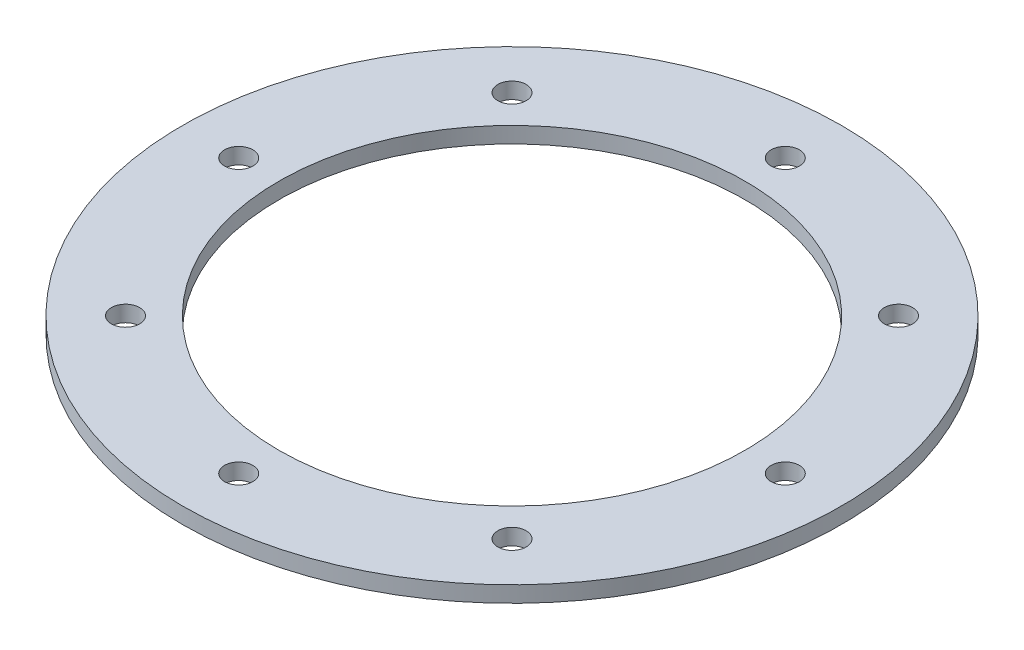
ISO-10303-21;
HEADER;
FILE_DESCRIPTION(('STEP AP214'),'2;1');
FILE_NAME('part.step','',(''),(''),'','','');
FILE_SCHEMA(('AUTOMOTIVE_DESIGN { 1 0 10303 214 1 1 1 1 }'));
ENDSEC;
DATA;
#1=APPLICATION_CONTEXT('core data for automotive mechanical design processes');
#2=APPLICATION_PROTOCOL_DEFINITION('international standard','automotive_design',2000,#1);
#3=PRODUCT_CONTEXT('',#1,'mechanical');
#4=PRODUCT('Part','Part','',(#3));
#5=PRODUCT_RELATED_PRODUCT_CATEGORY('part','',(#4));
#6=PRODUCT_DEFINITION_FORMATION('','',#4);
#7=PRODUCT_DEFINITION_CONTEXT('part definition',#1,'design');
#8=PRODUCT_DEFINITION('design','',#6,#7);
#9=PRODUCT_DEFINITION_SHAPE('','',#8);
#10=(LENGTH_UNIT() NAMED_UNIT(*) SI_UNIT(.MILLI.,.METRE.));
#11=(NAMED_UNIT(*) PLANE_ANGLE_UNIT() SI_UNIT($,.RADIAN.));
#12=(NAMED_UNIT(*) SI_UNIT($,.STERADIAN.) SOLID_ANGLE_UNIT());
#13=UNCERTAINTY_MEASURE_WITH_UNIT(LENGTH_MEASURE(1.E-05),#10,'distance_accuracy_value','');
#14=(GEOMETRIC_REPRESENTATION_CONTEXT(3) GLOBAL_UNCERTAINTY_ASSIGNED_CONTEXT((#13)) GLOBAL_UNIT_ASSIGNED_CONTEXT((#10,
#11,#12)) REPRESENTATION_CONTEXT('',''));
#15=CARTESIAN_POINT('',(0.,0.,0.));
#16=DIRECTION('',(0.,0.,1.));
#17=DIRECTION('',(1.,0.,0.));
#18=AXIS2_PLACEMENT_3D('',#15,#16,#17);
#19=CARTESIAN_POINT('',(0.,5.,0.));
#20=DIRECTION('',(0.,1.,0.));
#21=DIRECTION('',(0.,0.,1.));
#22=AXIS2_PLACEMENT_3D('',#19,#20,#21);
#23=PLANE('',#22);
#24=CARTESIAN_POINT('',(0.,5.,-85.));
#25=DIRECTION('',(0.,1.,0.));
#26=DIRECTION('',(0.,0.,1.));
#27=AXIS2_PLACEMENT_3D('',#24,#25,#26);
#28=CIRCLE('',#27,4.4);
#29=CARTESIAN_POINT('',(0.,5.,-80.6));
#30=VERTEX_POINT('',#29);
#31=EDGE_CURVE('E92',#30,#30,#28,.T.);
#32=ORIENTED_EDGE('',*,*,#31,.F.);
#33=EDGE_LOOP('',(#32));
#34=FACE_BOUND('',#33,.T.);
#35=CARTESIAN_POINT('',(-85.,5.,0.));
#36=DIRECTION('',(0.,1.,0.));
#37=DIRECTION('',(0.,0.,1.));
#38=AXIS2_PLACEMENT_3D('',#35,#36,#37);
#39=CIRCLE('',#38,4.4);
#40=CARTESIAN_POINT('',(-85.,5.,4.39999999999999));
#41=VERTEX_POINT('',#40);
#42=EDGE_CURVE('E79',#41,#41,#39,.T.);
#43=ORIENTED_EDGE('',*,*,#42,.F.);
#44=EDGE_LOOP('',(#43));
#45=FACE_BOUND('',#44,.T.);
#46=CARTESIAN_POINT('',(0.,5.,85.));
#47=DIRECTION('',(0.,1.,0.));
#48=DIRECTION('',(0.,0.,1.));
#49=AXIS2_PLACEMENT_3D('',#46,#47,#48);
#50=CIRCLE('',#49,4.4);
#51=CARTESIAN_POINT('',(0.,5.,89.4));
#52=VERTEX_POINT('',#51);
#53=EDGE_CURVE('E70',#52,#52,#50,.T.);
#54=ORIENTED_EDGE('',*,*,#53,.F.);
#55=EDGE_LOOP('',(#54));
#56=FACE_BOUND('',#55,.T.);
#57=CARTESIAN_POINT('',(85.,5.,0.));
#58=DIRECTION('',(0.,1.,0.));
#59=DIRECTION('',(0.,0.,1.));
#60=AXIS2_PLACEMENT_3D('',#57,#58,#59);
#61=CIRCLE('',#60,4.4);
#62=CARTESIAN_POINT('',(85.,5.,4.4));
#63=VERTEX_POINT('',#62);
#64=EDGE_CURVE('E54',#63,#63,#61,.T.);
#65=ORIENTED_EDGE('',*,*,#64,.F.);
#66=EDGE_LOOP('',(#65));
#67=FACE_BOUND('',#66,.T.);
#68=CARTESIAN_POINT('',(0.,5.,0.));
#69=DIRECTION('',(0.,1.,0.));
#70=DIRECTION('',(0.,0.,1.));
#71=AXIS2_PLACEMENT_3D('',#68,#69,#70);
#72=CIRCLE('',#71,102.5);
#73=CARTESIAN_POINT('',(0.,5.,102.5));
#74=VERTEX_POINT('',#73);
#75=EDGE_CURVE('E10',#74,#74,#72,.T.);
#76=ORIENTED_EDGE('',*,*,#75,.T.);
#77=EDGE_LOOP('',(#76));
#78=FACE_BOUND('',#77,.T.);
#79=CARTESIAN_POINT('',(0.,5.,0.));
#80=DIRECTION('',(0.,1.,0.));
#81=DIRECTION('',(0.,0.,1.));
#82=AXIS2_PLACEMENT_3D('',#79,#80,#81);
#83=CIRCLE('',#82,72.5);
#84=CARTESIAN_POINT('',(0.,5.,72.5));
#85=VERTEX_POINT('',#84);
#86=EDGE_CURVE('E49',#85,#85,#83,.T.);
#87=ORIENTED_EDGE('',*,*,#86,.F.);
#88=EDGE_LOOP('',(#87));
#89=FACE_BOUND('',#88,.T.);
#90=CARTESIAN_POINT('',(60.1040764008565,5.,60.1040764008565));
#91=DIRECTION('',(0.,1.,0.));
#92=DIRECTION('',(0.,0.,1.));
#93=AXIS2_PLACEMENT_3D('',#90,#91,#92);
#94=CIRCLE('',#93,4.39999999999997);
#95=CARTESIAN_POINT('',(60.1040764008565,5.,64.5040764008565));
#96=VERTEX_POINT('',#95);
#97=EDGE_CURVE('E63',#96,#96,#94,.T.);
#98=ORIENTED_EDGE('',*,*,#97,.F.);
#99=EDGE_LOOP('',(#98));
#100=FACE_BOUND('',#99,.T.);
#101=CARTESIAN_POINT('',(-60.1040764008565,5.,60.1040764008565));
#102=DIRECTION('',(0.,1.,0.));
#103=DIRECTION('',(0.,0.,1.));
#104=AXIS2_PLACEMENT_3D('',#101,#102,#103);
#105=CIRCLE('',#104,4.4);
#106=CARTESIAN_POINT('',(-60.1040764008565,5.,64.5040764008565));
#107=VERTEX_POINT('',#106);
#108=EDGE_CURVE('E75',#107,#107,#105,.T.);
#109=ORIENTED_EDGE('',*,*,#108,.F.);
#110=EDGE_LOOP('',(#109));
#111=FACE_BOUND('',#110,.T.);
#112=CARTESIAN_POINT('',(-60.1040764008565,5.,-60.1040764008566));
#113=DIRECTION('',(0.,1.,0.));
#114=DIRECTION('',(0.,0.,1.));
#115=AXIS2_PLACEMENT_3D('',#112,#113,#114);
#116=CIRCLE('',#115,4.4);
#117=CARTESIAN_POINT('',(-60.1040764008565,5.,-55.7040764008566));
#118=VERTEX_POINT('',#117);
#119=EDGE_CURVE('E81',#118,#118,#116,.T.);
#120=ORIENTED_EDGE('',*,*,#119,.F.);
#121=EDGE_LOOP('',(#120));
#122=FACE_BOUND('',#121,.T.);
#123=CARTESIAN_POINT('',(60.1040764008566,5.,-60.1040764008565));
#124=DIRECTION('',(0.,1.,0.));
#125=DIRECTION('',(0.,0.,1.));
#126=AXIS2_PLACEMENT_3D('',#123,#124,#125);
#127=CIRCLE('',#126,4.4);
#128=CARTESIAN_POINT('',(60.1040764008566,5.,-55.7040764008565));
#129=VERTEX_POINT('',#128);
#130=EDGE_CURVE('E97',#129,#129,#127,.T.);
#131=ORIENTED_EDGE('',*,*,#130,.F.);
#132=EDGE_LOOP('',(#131));
#133=FACE_BOUND('',#132,.T.);
#134=ADVANCED_FACE('F39',(#34,#45,#56,#67,#78,#89,#100,#111,#122,#133),#23,.T.);
#135=CARTESIAN_POINT('',(0.,0.,0.));
#136=DIRECTION('',(0.,1.,0.));
#137=DIRECTION('',(0.,0.,1.));
#138=AXIS2_PLACEMENT_3D('',#135,#136,#137);
#139=PLANE('',#138);
#140=CARTESIAN_POINT('',(0.,0.,0.));
#141=DIRECTION('',(0.,1.,0.));
#142=DIRECTION('',(0.,0.,1.));
#143=AXIS2_PLACEMENT_3D('',#140,#141,#142);
#144=CIRCLE('',#143,102.5);
#145=CARTESIAN_POINT('',(0.,0.,102.5));
#146=VERTEX_POINT('',#145);
#147=EDGE_CURVE('E43',#146,#146,#144,.T.);
#148=ORIENTED_EDGE('',*,*,#147,.F.);
#149=EDGE_LOOP('',(#148));
#150=FACE_BOUND('',#149,.T.);
#151=CARTESIAN_POINT('',(0.,0.,0.));
#152=DIRECTION('',(0.,1.,0.));
#153=DIRECTION('',(0.,0.,1.));
#154=AXIS2_PLACEMENT_3D('',#151,#152,#153);
#155=CIRCLE('',#154,72.5);
#156=CARTESIAN_POINT('',(0.,0.,72.5));
#157=VERTEX_POINT('',#156);
#158=EDGE_CURVE('E55',#157,#157,#155,.T.);
#159=ORIENTED_EDGE('',*,*,#158,.T.);
#160=EDGE_LOOP('',(#159));
#161=FACE_BOUND('',#160,.T.);
#162=CARTESIAN_POINT('',(85.,0.,0.));
#163=DIRECTION('',(0.,1.,0.));
#164=DIRECTION('',(0.,0.,1.));
#165=AXIS2_PLACEMENT_3D('',#162,#163,#164);
#166=CIRCLE('',#165,4.4);
#167=CARTESIAN_POINT('',(85.,0.,4.4));
#168=VERTEX_POINT('',#167);
#169=EDGE_CURVE('E59',#168,#168,#166,.T.);
#170=ORIENTED_EDGE('',*,*,#169,.T.);
#171=EDGE_LOOP('',(#170));
#172=FACE_BOUND('',#171,.T.);
#173=CARTESIAN_POINT('',(60.1040764008565,0.,60.1040764008565));
#174=DIRECTION('',(0.,1.,0.));
#175=DIRECTION('',(0.,0.,1.));
#176=AXIS2_PLACEMENT_3D('',#173,#174,#175);
#177=CIRCLE('',#176,4.39999999999997);
#178=CARTESIAN_POINT('',(60.1040764008565,0.,64.5040764008565));
#179=VERTEX_POINT('',#178);
#180=EDGE_CURVE('E65',#179,#179,#177,.T.);
#181=ORIENTED_EDGE('',*,*,#180,.T.);
#182=EDGE_LOOP('',(#181));
#183=FACE_BOUND('',#182,.T.);
#184=CARTESIAN_POINT('',(0.,0.,85.));
#185=DIRECTION('',(0.,1.,0.));
#186=DIRECTION('',(0.,0.,1.));
#187=AXIS2_PLACEMENT_3D('',#184,#185,#186);
#188=CIRCLE('',#187,4.4);
#189=CARTESIAN_POINT('',(0.,0.,89.4));
#190=VERTEX_POINT('',#189);
#191=EDGE_CURVE('E69',#190,#190,#188,.T.);
#192=ORIENTED_EDGE('',*,*,#191,.T.);
#193=EDGE_LOOP('',(#192));
#194=FACE_BOUND('',#193,.T.);
#195=CARTESIAN_POINT('',(-60.1040764008565,0.,60.1040764008565));
#196=DIRECTION('',(0.,1.,0.));
#197=DIRECTION('',(0.,0.,1.));
#198=AXIS2_PLACEMENT_3D('',#195,#196,#197);
#199=CIRCLE('',#198,4.4);
#200=CARTESIAN_POINT('',(-60.1040764008565,0.,64.5040764008565));
#201=VERTEX_POINT('',#200);
#202=EDGE_CURVE('E77',#201,#201,#199,.T.);
#203=ORIENTED_EDGE('',*,*,#202,.T.);
#204=EDGE_LOOP('',(#203));
#205=FACE_BOUND('',#204,.T.);
#206=CARTESIAN_POINT('',(-85.,0.,0.));
#207=DIRECTION('',(0.,1.,0.));
#208=DIRECTION('',(0.,0.,1.));
#209=AXIS2_PLACEMENT_3D('',#206,#207,#208);
#210=CIRCLE('',#209,4.4);
#211=CARTESIAN_POINT('',(-85.,0.,4.39999999999999));
#212=VERTEX_POINT('',#211);
#213=EDGE_CURVE('E84',#212,#212,#210,.T.);
#214=ORIENTED_EDGE('',*,*,#213,.T.);
#215=EDGE_LOOP('',(#214));
#216=FACE_BOUND('',#215,.T.);
#217=CARTESIAN_POINT('',(-60.1040764008565,0.,-60.1040764008566));
#218=DIRECTION('',(0.,1.,0.));
#219=DIRECTION('',(0.,0.,1.));
#220=AXIS2_PLACEMENT_3D('',#217,#218,#219);
#221=CIRCLE('',#220,4.4);
#222=CARTESIAN_POINT('',(-60.1040764008565,0.,-55.7040764008566));
#223=VERTEX_POINT('',#222);
#224=EDGE_CURVE('E86',#223,#223,#221,.T.);
#225=ORIENTED_EDGE('',*,*,#224,.T.);
#226=EDGE_LOOP('',(#225));
#227=FACE_BOUND('',#226,.T.);
#228=CARTESIAN_POINT('',(0.,0.,-85.));
#229=DIRECTION('',(0.,1.,0.));
#230=DIRECTION('',(0.,0.,1.));
#231=AXIS2_PLACEMENT_3D('',#228,#229,#230);
#232=CIRCLE('',#231,4.4);
#233=CARTESIAN_POINT('',(0.,0.,-80.6));
#234=VERTEX_POINT('',#233);
#235=EDGE_CURVE('E91',#234,#234,#232,.T.);
#236=ORIENTED_EDGE('',*,*,#235,.T.);
#237=EDGE_LOOP('',(#236));
#238=FACE_BOUND('',#237,.T.);
#239=CARTESIAN_POINT('',(60.1040764008566,0.,-60.1040764008565));
#240=DIRECTION('',(0.,1.,0.));
#241=DIRECTION('',(0.,0.,1.));
#242=AXIS2_PLACEMENT_3D('',#239,#240,#241);
#243=CIRCLE('',#242,4.4);
#244=CARTESIAN_POINT('',(60.1040764008566,0.,-55.7040764008565));
#245=VERTEX_POINT('',#244);
#246=EDGE_CURVE('E99',#245,#245,#243,.T.);
#247=ORIENTED_EDGE('',*,*,#246,.T.);
#248=EDGE_LOOP('',(#247));
#249=FACE_BOUND('',#248,.T.);
#250=ADVANCED_FACE('F109',(#150,#161,#172,#183,#194,#205,#216,#227,#238,#249),#139,.F.);
#251=CARTESIAN_POINT('',(0.,5.,0.));
#252=DIRECTION('',(0.,-1.,0.));
#253=DIRECTION('',(0.,0.,-1.));
#254=AXIS2_PLACEMENT_3D('',#251,#252,#253);
#255=CYLINDRICAL_SURFACE('',#254,102.5);
#256=ORIENTED_EDGE('',*,*,#75,.F.);
#257=EDGE_LOOP('',(#256));
#258=FACE_BOUND('',#257,.T.);
#259=ORIENTED_EDGE('',*,*,#147,.T.);
#260=EDGE_LOOP('',(#259));
#261=FACE_BOUND('',#260,.T.);
#262=ADVANCED_FACE('F41',(#258,#261),#255,.T.);
#263=CARTESIAN_POINT('',(0.,5.,0.));
#264=DIRECTION('',(0.,-1.,0.));
#265=DIRECTION('',(0.,0.,-1.));
#266=AXIS2_PLACEMENT_3D('',#263,#264,#265);
#267=CYLINDRICAL_SURFACE('',#266,72.5);
#268=ORIENTED_EDGE('',*,*,#86,.T.);
#269=EDGE_LOOP('',(#268));
#270=FACE_BOUND('',#269,.T.);
#271=ORIENTED_EDGE('',*,*,#158,.F.);
#272=EDGE_LOOP('',(#271));
#273=FACE_BOUND('',#272,.T.);
#274=ADVANCED_FACE('F119',(#270,#273),#267,.F.);
#275=CARTESIAN_POINT('',(85.,5.,0.));
#276=DIRECTION('',(0.,-1.,0.));
#277=DIRECTION('',(0.,0.,-1.));
#278=AXIS2_PLACEMENT_3D('',#275,#276,#277);
#279=CYLINDRICAL_SURFACE('',#278,4.4);
#280=ORIENTED_EDGE('',*,*,#64,.T.);
#281=EDGE_LOOP('',(#280));
#282=FACE_BOUND('',#281,.T.);
#283=ORIENTED_EDGE('',*,*,#169,.F.);
#284=EDGE_LOOP('',(#283));
#285=FACE_BOUND('',#284,.T.);
#286=ADVANCED_FACE('F124',(#282,#285),#279,.F.);
#287=CARTESIAN_POINT('',(60.1040764008565,5.,60.1040764008565));
#288=DIRECTION('',(0.,-1.,0.));
#289=DIRECTION('',(0.,0.,-1.));
#290=AXIS2_PLACEMENT_3D('',#287,#288,#289);
#291=CYLINDRICAL_SURFACE('',#290,4.39999999999997);
#292=ORIENTED_EDGE('',*,*,#97,.T.);
#293=EDGE_LOOP('',(#292));
#294=FACE_BOUND('',#293,.T.);
#295=ORIENTED_EDGE('',*,*,#180,.F.);
#296=EDGE_LOOP('',(#295));
#297=FACE_BOUND('',#296,.T.);
#298=ADVANCED_FACE('F129',(#294,#297),#291,.F.);
#299=CARTESIAN_POINT('',(0.,5.,85.));
#300=DIRECTION('',(0.,-1.,0.));
#301=DIRECTION('',(0.,0.,-1.));
#302=AXIS2_PLACEMENT_3D('',#299,#300,#301);
#303=CYLINDRICAL_SURFACE('',#302,4.4);
#304=ORIENTED_EDGE('',*,*,#53,.T.);
#305=EDGE_LOOP('',(#304));
#306=FACE_BOUND('',#305,.T.);
#307=ORIENTED_EDGE('',*,*,#191,.F.);
#308=EDGE_LOOP('',(#307));
#309=FACE_BOUND('',#308,.T.);
#310=ADVANCED_FACE('F133',(#306,#309),#303,.F.);
#311=CARTESIAN_POINT('',(-60.1040764008565,5.,60.1040764008565));
#312=DIRECTION('',(0.,-1.,0.));
#313=DIRECTION('',(0.,0.,-1.));
#314=AXIS2_PLACEMENT_3D('',#311,#312,#313);
#315=CYLINDRICAL_SURFACE('',#314,4.4);
#316=ORIENTED_EDGE('',*,*,#108,.T.);
#317=EDGE_LOOP('',(#316));
#318=FACE_BOUND('',#317,.T.);
#319=ORIENTED_EDGE('',*,*,#202,.F.);
#320=EDGE_LOOP('',(#319));
#321=FACE_BOUND('',#320,.T.);
#322=ADVANCED_FACE('F134',(#318,#321),#315,.F.);
#323=CARTESIAN_POINT('',(-85.,5.,0.));
#324=DIRECTION('',(0.,-1.,0.));
#325=DIRECTION('',(0.,0.,-1.));
#326=AXIS2_PLACEMENT_3D('',#323,#324,#325);
#327=CYLINDRICAL_SURFACE('',#326,4.4);
#328=ORIENTED_EDGE('',*,*,#42,.T.);
#329=EDGE_LOOP('',(#328));
#330=FACE_BOUND('',#329,.T.);
#331=ORIENTED_EDGE('',*,*,#213,.F.);
#332=EDGE_LOOP('',(#331));
#333=FACE_BOUND('',#332,.T.);
#334=ADVANCED_FACE('F136',(#330,#333),#327,.F.);
#335=CARTESIAN_POINT('',(-60.1040764008565,5.,-60.1040764008566));
#336=DIRECTION('',(0.,-1.,0.));
#337=DIRECTION('',(0.,0.,-1.));
#338=AXIS2_PLACEMENT_3D('',#335,#336,#337);
#339=CYLINDRICAL_SURFACE('',#338,4.4);
#340=ORIENTED_EDGE('',*,*,#119,.T.);
#341=EDGE_LOOP('',(#340));
#342=FACE_BOUND('',#341,.T.);
#343=ORIENTED_EDGE('',*,*,#224,.F.);
#344=EDGE_LOOP('',(#343));
#345=FACE_BOUND('',#344,.T.);
#346=ADVANCED_FACE('F141',(#342,#345),#339,.F.);
#347=CARTESIAN_POINT('',(0.,5.,-85.));
#348=DIRECTION('',(0.,-1.,0.));
#349=DIRECTION('',(0.,0.,-1.));
#350=AXIS2_PLACEMENT_3D('',#347,#348,#349);
#351=CYLINDRICAL_SURFACE('',#350,4.4);
#352=ORIENTED_EDGE('',*,*,#31,.T.);
#353=EDGE_LOOP('',(#352));
#354=FACE_BOUND('',#353,.T.);
#355=ORIENTED_EDGE('',*,*,#235,.F.);
#356=EDGE_LOOP('',(#355));
#357=FACE_BOUND('',#356,.T.);
#358=ADVANCED_FACE('F149',(#354,#357),#351,.F.);
#359=CARTESIAN_POINT('',(60.1040764008566,5.,-60.1040764008565));
#360=DIRECTION('',(0.,-1.,0.));
#361=DIRECTION('',(0.,0.,-1.));
#362=AXIS2_PLACEMENT_3D('',#359,#360,#361);
#363=CYLINDRICAL_SURFACE('',#362,4.4);
#364=ORIENTED_EDGE('',*,*,#130,.T.);
#365=EDGE_LOOP('',(#364));
#366=FACE_BOUND('',#365,.T.);
#367=ORIENTED_EDGE('',*,*,#246,.F.);
#368=EDGE_LOOP('',(#367));
#369=FACE_BOUND('',#368,.T.);
#370=ADVANCED_FACE('F106',(#366,#369),#363,.F.);
#371=CLOSED_SHELL('',(#134,#250,#262,#274,#286,#298,#310,#322,#334,#346,#358,#370));
#372=MANIFOLD_SOLID_BREP('B2',#371);
#373=ADVANCED_BREP_SHAPE_REPRESENTATION('',(#18,#372),#14);
#374=SHAPE_DEFINITION_REPRESENTATION(#9,#373);
ENDSEC;
END-ISO-10303-21;
